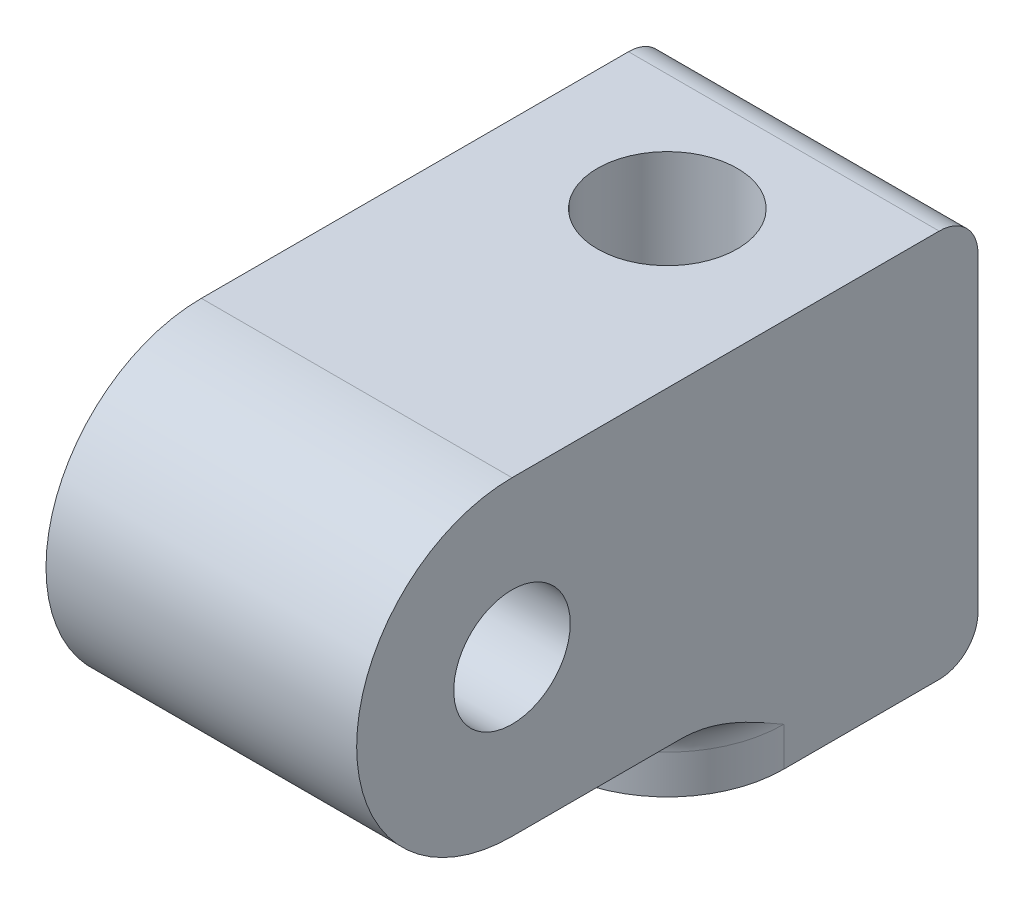
ISO-10303-21;
HEADER;
FILE_DESCRIPTION(('STEP AP214'),'2;1');
FILE_NAME('part.step','',(''),(''),'','','');
FILE_SCHEMA(('AUTOMOTIVE_DESIGN { 1 0 10303 214 1 1 1 1 }'));
ENDSEC;
DATA;
#1=APPLICATION_CONTEXT('core data for automotive mechanical design processes');
#2=APPLICATION_PROTOCOL_DEFINITION('international standard','automotive_design',2000,#1);
#3=PRODUCT_CONTEXT('',#1,'mechanical');
#4=PRODUCT('Part','Part','',(#3));
#5=PRODUCT_RELATED_PRODUCT_CATEGORY('part','',(#4));
#6=PRODUCT_DEFINITION_FORMATION('','',#4);
#7=PRODUCT_DEFINITION_CONTEXT('part definition',#1,'design');
#8=PRODUCT_DEFINITION('design','',#6,#7);
#9=PRODUCT_DEFINITION_SHAPE('','',#8);
#10=(LENGTH_UNIT() NAMED_UNIT(*) SI_UNIT(.MILLI.,.METRE.));
#11=(NAMED_UNIT(*) PLANE_ANGLE_UNIT() SI_UNIT($,.RADIAN.));
#12=(NAMED_UNIT(*) SI_UNIT($,.STERADIAN.) SOLID_ANGLE_UNIT());
#13=UNCERTAINTY_MEASURE_WITH_UNIT(LENGTH_MEASURE(1.E-05),#10,'distance_accuracy_value','');
#14=(GEOMETRIC_REPRESENTATION_CONTEXT(3) GLOBAL_UNCERTAINTY_ASSIGNED_CONTEXT((#13)) GLOBAL_UNIT_ASSIGNED_CONTEXT((#10,
#11,#12)) REPRESENTATION_CONTEXT('',''));
#15=CARTESIAN_POINT('',(0.,0.,0.));
#16=DIRECTION('',(0.,0.,1.));
#17=DIRECTION('',(1.,0.,0.));
#18=AXIS2_PLACEMENT_3D('',#15,#16,#17);
#19=CARTESIAN_POINT('',(10.16,7.62,5.08));
#20=DIRECTION('',(1.,0.,0.));
#21=DIRECTION('',(0.,0.,-1.));
#22=AXIS2_PLACEMENT_3D('',#19,#20,#21);
#23=PLANE('',#22);
#24=DIRECTION('',(0.,1.,0.));
#25=VECTOR('',#24,1.);
#26=CARTESIAN_POINT('',(10.16,0.,-10.16));
#27=LINE('',#26,#25);
#28=CARTESIAN_POINT('',(10.16,1.27,-10.16));
#29=VERTEX_POINT('',#28);
#30=CARTESIAN_POINT('',(10.16,11.43,-10.16));
#31=VERTEX_POINT('',#30);
#32=EDGE_CURVE('E171',#29,#31,#27,.T.);
#33=ORIENTED_EDGE('',*,*,#32,.T.);
#34=CARTESIAN_POINT('',(10.16,11.43,-8.89));
#35=DIRECTION('',(1.,0.,0.));
#36=DIRECTION('',(0.,0.,-1.));
#37=AXIS2_PLACEMENT_3D('',#34,#35,#36);
#38=CIRCLE('',#37,1.27);
#39=CARTESIAN_POINT('',(10.16,12.7,-8.89));
#40=VERTEX_POINT('',#39);
#41=EDGE_CURVE('E166',#31,#40,#38,.T.);
#42=ORIENTED_EDGE('',*,*,#41,.T.);
#43=DIRECTION('',(0.,0.,1.));
#44=VECTOR('',#43,1.);
#45=CARTESIAN_POINT('',(10.16,12.7,5.08));
#46=LINE('',#45,#44);
#47=CARTESIAN_POINT('',(10.16,12.7,5.08));
#48=VERTEX_POINT('',#47);
#49=EDGE_CURVE('E158',#40,#48,#46,.T.);
#50=ORIENTED_EDGE('',*,*,#49,.T.);
#51=CARTESIAN_POINT('',(10.16,7.62,5.08));
#52=DIRECTION('',(1.,0.,0.));
#53=DIRECTION('',(0.,0.,-1.));
#54=AXIS2_PLACEMENT_3D('',#51,#52,#53);
#55=CIRCLE('',#54,5.08);
#56=CARTESIAN_POINT('',(10.16,2.54,5.08));
#57=VERTEX_POINT('',#56);
#58=EDGE_CURVE('E163',#48,#57,#55,.T.);
#59=ORIENTED_EDGE('',*,*,#58,.T.);
#60=DIRECTION('',(0.,0.,-1.));
#61=VECTOR('',#60,1.);
#62=CARTESIAN_POINT('',(10.16,2.54,0.));
#63=LINE('',#62,#61);
#64=CARTESIAN_POINT('',(10.16,2.54,-0.44989583494797));
#65=VERTEX_POINT('',#64);
#66=EDGE_CURVE('E186',#57,#65,#63,.T.);
#67=ORIENTED_EDGE('',*,*,#66,.T.);
#68=CARTESIAN_POINT('',(10.16,2.54,-0.44989583494797));
#69=CARTESIAN_POINT('',(10.16,2.53997532268012,-0.545894472985572));
#70=CARTESIAN_POINT('',(10.16,2.5352435060237,-0.641762735367153));
#71=CARTESIAN_POINT('',(10.16,2.51758605749741,-0.832551529192772));
#72=CARTESIAN_POINT('',(10.16,2.50467796523076,-0.927473648641121));
#73=CARTESIAN_POINT('',(10.16,2.45595465593844,-1.20766904418462));
#74=CARTESIAN_POINT('',(10.16,2.41006676780424,-1.39118255383151));
#75=CARTESIAN_POINT('',(10.16,2.29361749517263,-1.76829186278118));
#76=CARTESIAN_POINT('',(10.16,2.22118700738842,-1.9612800146793));
#77=CARTESIAN_POINT('',(10.16,2.06041239317766,-2.34059070990035));
#78=CARTESIAN_POINT('',(10.16,1.97204999837862,-2.52690530388413));
#79=CARTESIAN_POINT('',(10.16,1.69108343218396,-3.08056685235503));
#80=CARTESIAN_POINT('',(10.16,1.48355930440187,-3.44010351414735));
#81=CARTESIAN_POINT('',(10.16,1.27411498100709,-3.80287261045626));
#82=CARTESIAN_POINT('',(10.16,1.2720574740064,-3.80643631663206));
#83=CARTESIAN_POINT('',(10.16,1.27,-3.81));
#84=B_SPLINE_CURVE_WITH_KNOTS('',3,(#68,#69,#70,#71,#72,#73,#74,#75,#76,#77,#78,#79,#80,#81,#82,
#83),.UNSPECIFIED.,.F.,.F.,(4,2,2,2,2,2,2,4),(0.,0.287684771107204,0.57475448628994,
1.14055140327335,1.75796809411921,2.37609730305224,3.62040969245718,3.63275473194816),.UNSPECIFIED.);
#85=CARTESIAN_POINT('',(10.16,1.27,-3.81));
#86=VERTEX_POINT('',#85);
#87=EDGE_CURVE('E52',#65,#86,#84,.T.);
#88=ORIENTED_EDGE('',*,*,#87,.T.);
#89=DIRECTION('',(0.,-1.,0.));
#90=VECTOR('',#89,1.);
#91=CARTESIAN_POINT('',(10.16,0.,-3.81));
#92=LINE('',#91,#90);
#93=CARTESIAN_POINT('',(10.16,0.,-3.81));
#94=VERTEX_POINT('',#93);
#95=EDGE_CURVE('E213',#86,#94,#92,.T.);
#96=ORIENTED_EDGE('',*,*,#95,.T.);
#97=DIRECTION('',(0.,0.,-1.));
#98=VECTOR('',#97,1.);
#99=CARTESIAN_POINT('',(10.16,0.,0.));
#100=LINE('',#99,#98);
#101=CARTESIAN_POINT('',(10.16,0.,-8.89));
#102=VERTEX_POINT('',#101);
#103=EDGE_CURVE('E207',#94,#102,#100,.T.);
#104=ORIENTED_EDGE('',*,*,#103,.T.);
#105=CARTESIAN_POINT('',(10.16,1.27,-8.89));
#106=DIRECTION('',(1.,0.,0.));
#107=DIRECTION('',(0.,0.,-1.));
#108=AXIS2_PLACEMENT_3D('',#105,#106,#107);
#109=CIRCLE('',#108,1.27);
#110=EDGE_CURVE('E264',#102,#29,#109,.T.);
#111=ORIENTED_EDGE('',*,*,#110,.T.);
#112=EDGE_LOOP('',(#33,#42,#50,#59,#67,#88,#96,#104,#111));
#113=FACE_BOUND('',#112,.T.);
#114=CARTESIAN_POINT('',(10.16,7.62,5.08));
#115=DIRECTION('',(1.,0.,0.));
#116=DIRECTION('',(0.,0.,-1.));
#117=AXIS2_PLACEMENT_3D('',#114,#115,#116);
#118=CIRCLE('',#117,1.905);
#119=CARTESIAN_POINT('',(10.16,7.62,3.175));
#120=VERTEX_POINT('',#119);
#121=EDGE_CURVE('E196',#120,#120,#118,.T.);
#122=ORIENTED_EDGE('',*,*,#121,.F.);
#123=EDGE_LOOP('',(#122));
#124=FACE_BOUND('',#123,.T.);
#125=ADVANCED_FACE('F42',(#113,#124),#23,.T.);
#126=CARTESIAN_POINT('',(0.,7.62,5.08));
#127=DIRECTION('',(1.,0.,0.));
#128=DIRECTION('',(0.,0.,-1.));
#129=AXIS2_PLACEMENT_3D('',#126,#127,#128);
#130=PLANE('',#129);
#131=DIRECTION('',(0.,0.,1.));
#132=VECTOR('',#131,1.);
#133=CARTESIAN_POINT('',(0.,12.7,5.08));
#134=LINE('',#133,#132);
#135=CARTESIAN_POINT('',(0.,12.7,-8.89));
#136=VERTEX_POINT('',#135);
#137=CARTESIAN_POINT('',(0.,12.7,5.08));
#138=VERTEX_POINT('',#137);
#139=EDGE_CURVE('E177',#136,#138,#134,.T.);
#140=ORIENTED_EDGE('',*,*,#139,.F.);
#141=CARTESIAN_POINT('',(0.,11.43,-8.89));
#142=DIRECTION('',(1.,0.,0.));
#143=DIRECTION('',(0.,0.,-1.));
#144=AXIS2_PLACEMENT_3D('',#141,#142,#143);
#145=CIRCLE('',#144,1.27);
#146=CARTESIAN_POINT('',(0.,11.43,-10.16));
#147=VERTEX_POINT('',#146);
#148=EDGE_CURVE('E255',#136,#147,#145,.F.);
#149=ORIENTED_EDGE('',*,*,#148,.T.);
#150=DIRECTION('',(0.,1.,0.));
#151=VECTOR('',#150,1.);
#152=CARTESIAN_POINT('',(0.,0.,-10.16));
#153=LINE('',#152,#151);
#154=CARTESIAN_POINT('',(0.,1.27,-10.16));
#155=VERTEX_POINT('',#154);
#156=EDGE_CURVE('E195',#155,#147,#153,.T.);
#157=ORIENTED_EDGE('',*,*,#156,.F.);
#158=CARTESIAN_POINT('',(0.,1.27,-8.89));
#159=DIRECTION('',(1.,0.,0.));
#160=DIRECTION('',(0.,0.,-1.));
#161=AXIS2_PLACEMENT_3D('',#158,#159,#160);
#162=CIRCLE('',#161,1.27);
#163=CARTESIAN_POINT('',(0.,0.,-8.89));
#164=VERTEX_POINT('',#163);
#165=EDGE_CURVE('E252',#155,#164,#162,.F.);
#166=ORIENTED_EDGE('',*,*,#165,.T.);
#167=DIRECTION('',(0.,0.,-1.));
#168=VECTOR('',#167,1.);
#169=CARTESIAN_POINT('',(0.,0.,0.));
#170=LINE('',#169,#168);
#171=CARTESIAN_POINT('',(0.,0.,-3.81));
#172=VERTEX_POINT('',#171);
#173=EDGE_CURVE('E192',#172,#164,#170,.T.);
#174=ORIENTED_EDGE('',*,*,#173,.F.);
#175=DIRECTION('',(0.,-1.,0.));
#176=VECTOR('',#175,1.);
#177=CARTESIAN_POINT('',(0.,7.62,-3.81));
#178=LINE('',#177,#176);
#179=CARTESIAN_POINT('',(0.,1.27,-3.81));
#180=VERTEX_POINT('',#179);
#181=EDGE_CURVE('E229',#172,#180,#178,.F.);
#182=ORIENTED_EDGE('',*,*,#181,.T.);
#183=CARTESIAN_POINT('',(0.,2.54,-0.44989583494797));
#184=CARTESIAN_POINT('',(0.,2.53997532268012,-0.545894472985575));
#185=CARTESIAN_POINT('',(0.,2.5352435060237,-0.641762735367158));
#186=CARTESIAN_POINT('',(0.,2.51758605749741,-0.832551529192782));
#187=CARTESIAN_POINT('',(0.,2.50467796523075,-0.927473648641132));
#188=CARTESIAN_POINT('',(0.,2.45595465593844,-1.20766904418463));
#189=CARTESIAN_POINT('',(0.,2.41006676780424,-1.39118255383152));
#190=CARTESIAN_POINT('',(0.,2.29361749517263,-1.76829186278117));
#191=CARTESIAN_POINT('',(0.,2.22118700738842,-1.9612800146793));
#192=CARTESIAN_POINT('',(0.,2.06041239317767,-2.34059070990034));
#193=CARTESIAN_POINT('',(0.,1.97204999837864,-2.52690530388412));
#194=CARTESIAN_POINT('',(0.,1.69108343218394,-3.08056685235501));
#195=CARTESIAN_POINT('',(0.,1.48355930440175,-3.44010351414727));
#196=CARTESIAN_POINT('',(0.,1.27411498100709,-3.80287261045626));
#197=CARTESIAN_POINT('',(0.,1.2720574740064,-3.80643631663206));
#198=CARTESIAN_POINT('',(0.,1.27,-3.81));
#199=B_SPLINE_CURVE_WITH_KNOTS('',3,(#183,#184,#185,#186,#187,#188,#189,#190,#191,#192,#193,
#194,#195,#196,#197,#198),.UNSPECIFIED.,.F.,.F.,(4,2,2,2,2,2,2,4),(0.,0.287684771107212,
0.574754486289953,1.14055140327335,1.7579680941192,2.37609730305223,3.62040969245718,
3.63275473194816),.UNSPECIFIED.);
#200=CARTESIAN_POINT('',(0.,2.54,-0.44989583494797));
#201=VERTEX_POINT('',#200);
#202=EDGE_CURVE('E11',#180,#201,#199,.F.);
#203=ORIENTED_EDGE('',*,*,#202,.T.);
#204=DIRECTION('',(0.,0.,-1.));
#205=VECTOR('',#204,1.);
#206=CARTESIAN_POINT('',(0.,2.54,0.));
#207=LINE('',#206,#205);
#208=CARTESIAN_POINT('',(0.,2.54,5.08));
#209=VERTEX_POINT('',#208);
#210=EDGE_CURVE('E203',#209,#201,#207,.T.);
#211=ORIENTED_EDGE('',*,*,#210,.F.);
#212=CARTESIAN_POINT('',(0.,7.62,5.08));
#213=DIRECTION('',(1.,0.,0.));
#214=DIRECTION('',(0.,0.,-1.));
#215=AXIS2_PLACEMENT_3D('',#212,#213,#214);
#216=CIRCLE('',#215,5.08);
#217=EDGE_CURVE('E201',#138,#209,#216,.T.);
#218=ORIENTED_EDGE('',*,*,#217,.F.);
#219=EDGE_LOOP('',(#140,#149,#157,#166,#174,#182,#203,#211,#218));
#220=FACE_BOUND('',#219,.T.);
#221=CARTESIAN_POINT('',(0.,7.62,5.08));
#222=DIRECTION('',(1.,0.,0.));
#223=DIRECTION('',(0.,0.,-1.));
#224=AXIS2_PLACEMENT_3D('',#221,#222,#223);
#225=CIRCLE('',#224,1.905);
#226=CARTESIAN_POINT('',(0.,7.62,3.175));
#227=VERTEX_POINT('',#226);
#228=EDGE_CURVE('E368',#227,#227,#225,.T.);
#229=ORIENTED_EDGE('',*,*,#228,.T.);
#230=EDGE_LOOP('',(#229));
#231=FACE_BOUND('',#230,.T.);
#232=ADVANCED_FACE('F294',(#220,#231),#130,.F.);
#233=CARTESIAN_POINT('',(10.16,0.,0.));
#234=DIRECTION('',(0.,0.,-1.));
#235=DIRECTION('',(0.,1.,0.));
#236=AXIS2_PLACEMENT_3D('',#233,#234,#235);
#237=PLANE('',#236);
#238=DIRECTION('',(0.,-1.,0.));
#239=VECTOR('',#238,1.);
#240=CARTESIAN_POINT('',(6.35,2.54,0.));
#241=LINE('',#240,#239);
#242=CARTESIAN_POINT('',(6.35,0.,0.));
#243=VERTEX_POINT('',#242);
#244=CARTESIAN_POINT('',(6.35,1.27,0.));
#245=VERTEX_POINT('',#244);
#246=EDGE_CURVE('E225',#243,#245,#241,.F.);
#247=ORIENTED_EDGE('',*,*,#246,.T.);
#248=DIRECTION('',(-1.,0.,0.));
#249=VECTOR('',#248,1.);
#250=CARTESIAN_POINT('',(3.81,1.27,0.));
#251=LINE('',#250,#249);
#252=CARTESIAN_POINT('',(3.81,1.27,0.));
#253=VERTEX_POINT('',#252);
#254=EDGE_CURVE('E271',#245,#253,#251,.T.);
#255=ORIENTED_EDGE('',*,*,#254,.T.);
#256=DIRECTION('',(0.,-1.,0.));
#257=VECTOR('',#256,1.);
#258=CARTESIAN_POINT('',(3.81,0.,0.));
#259=LINE('',#258,#257);
#260=CARTESIAN_POINT('',(3.81,0.,0.));
#261=VERTEX_POINT('',#260);
#262=EDGE_CURVE('E222',#253,#261,#259,.T.);
#263=ORIENTED_EDGE('',*,*,#262,.T.);
#264=DIRECTION('',(-1.,0.,0.));
#265=VECTOR('',#264,1.);
#266=CARTESIAN_POINT('',(10.16,0.,0.));
#267=LINE('',#266,#265);
#268=EDGE_CURVE('E180',#243,#261,#267,.T.);
#269=ORIENTED_EDGE('',*,*,#268,.F.);
#270=EDGE_LOOP('',(#247,#255,#263,#269));
#271=FACE_BOUND('',#270,.T.);
#272=ADVANCED_FACE('F300',(#271),#237,.F.);
#273=CARTESIAN_POINT('',(10.16,0.,0.));
#274=DIRECTION('',(0.,1.,0.));
#275=DIRECTION('',(0.,0.,1.));
#276=AXIS2_PLACEMENT_3D('',#273,#274,#275);
#277=PLANE('',#276);
#278=CARTESIAN_POINT('',(5.08,0.,-5.08));
#279=DIRECTION('',(0.,1.,0.));
#280=DIRECTION('',(0.,0.,1.));
#281=AXIS2_PLACEMENT_3D('',#278,#279,#280);
#282=CIRCLE('',#281,2.286);
#283=CARTESIAN_POINT('',(5.08,0.,-2.794));
#284=VERTEX_POINT('',#283);
#285=EDGE_CURVE('E353',#284,#284,#282,.T.);
#286=ORIENTED_EDGE('',*,*,#285,.T.);
#287=EDGE_LOOP('',(#286));
#288=FACE_BOUND('',#287,.T.);
#289=ORIENTED_EDGE('',*,*,#173,.T.);
#290=DIRECTION('',(-1.,0.,0.));
#291=VECTOR('',#290,1.);
#292=CARTESIAN_POINT('',(10.16,0.,-8.89));
#293=LINE('',#292,#291);
#294=EDGE_CURVE('E63',#164,#102,#293,.F.);
#295=ORIENTED_EDGE('',*,*,#294,.T.);
#296=ORIENTED_EDGE('',*,*,#103,.F.);
#297=CARTESIAN_POINT('',(6.35,0.,-3.81));
#298=DIRECTION('',(0.,1.,0.));
#299=DIRECTION('',(0.,0.,1.));
#300=AXIS2_PLACEMENT_3D('',#297,#298,#299);
#301=CIRCLE('',#300,3.81);
#302=EDGE_CURVE('E219',#94,#243,#301,.F.);
#303=ORIENTED_EDGE('',*,*,#302,.T.);
#304=ORIENTED_EDGE('',*,*,#268,.T.);
#305=CARTESIAN_POINT('',(3.81,0.,-3.81));
#306=DIRECTION('',(0.,1.,0.));
#307=DIRECTION('',(0.,0.,1.));
#308=AXIS2_PLACEMENT_3D('',#305,#306,#307);
#309=CIRCLE('',#308,3.81);
#310=EDGE_CURVE('E216',#261,#172,#309,.F.);
#311=ORIENTED_EDGE('',*,*,#310,.T.);
#312=EDGE_LOOP('',(#289,#295,#296,#303,#304,#311));
#313=FACE_BOUND('',#312,.T.);
#314=ADVANCED_FACE('F314',(#288,#313),#277,.F.);
#315=CARTESIAN_POINT('',(10.16,0.,-10.16));
#316=DIRECTION('',(0.,0.,1.));
#317=DIRECTION('',(1.,0.,0.));
#318=AXIS2_PLACEMENT_3D('',#315,#316,#317);
#319=PLANE('',#318);
#320=ORIENTED_EDGE('',*,*,#156,.T.);
#321=DIRECTION('',(-1.,0.,0.));
#322=VECTOR('',#321,1.);
#323=CARTESIAN_POINT('',(10.16,11.43,-10.16));
#324=LINE('',#323,#322);
#325=EDGE_CURVE('E74',#147,#31,#324,.F.);
#326=ORIENTED_EDGE('',*,*,#325,.T.);
#327=ORIENTED_EDGE('',*,*,#32,.F.);
#328=DIRECTION('',(-1.,0.,0.));
#329=VECTOR('',#328,1.);
#330=CARTESIAN_POINT('',(10.16,1.27,-10.16));
#331=LINE('',#330,#329);
#332=EDGE_CURVE('E258',#29,#155,#331,.T.);
#333=ORIENTED_EDGE('',*,*,#332,.T.);
#334=EDGE_LOOP('',(#320,#326,#327,#333));
#335=FACE_BOUND('',#334,.T.);
#336=ADVANCED_FACE('F310',(#335),#319,.F.);
#337=CARTESIAN_POINT('',(10.16,12.7,5.08));
#338=DIRECTION('',(0.,-1.,0.));
#339=DIRECTION('',(0.,0.,-1.));
#340=AXIS2_PLACEMENT_3D('',#337,#338,#339);
#341=PLANE('',#340);
#342=CARTESIAN_POINT('',(5.08,12.7,-5.08));
#343=DIRECTION('',(0.,1.,0.));
#344=DIRECTION('',(0.,0.,1.));
#345=AXIS2_PLACEMENT_3D('',#342,#343,#344);
#346=CIRCLE('',#345,2.286);
#347=CARTESIAN_POINT('',(5.08,12.7,-2.794));
#348=VERTEX_POINT('',#347);
#349=EDGE_CURVE('E349',#348,#348,#346,.T.);
#350=ORIENTED_EDGE('',*,*,#349,.F.);
#351=EDGE_LOOP('',(#350));
#352=FACE_BOUND('',#351,.T.);
#353=ORIENTED_EDGE('',*,*,#49,.F.);
#354=DIRECTION('',(-1.,0.,0.));
#355=VECTOR('',#354,1.);
#356=CARTESIAN_POINT('',(10.16,12.7,-8.89));
#357=LINE('',#356,#355);
#358=EDGE_CURVE('E249',#40,#136,#357,.T.);
#359=ORIENTED_EDGE('',*,*,#358,.T.);
#360=ORIENTED_EDGE('',*,*,#139,.T.);
#361=DIRECTION('',(-1.,0.,0.));
#362=VECTOR('',#361,1.);
#363=CARTESIAN_POINT('',(10.16,12.7,5.08));
#364=LINE('',#363,#362);
#365=EDGE_CURVE('E174',#48,#138,#364,.T.);
#366=ORIENTED_EDGE('',*,*,#365,.F.);
#367=EDGE_LOOP('',(#353,#359,#360,#366));
#368=FACE_BOUND('',#367,.T.);
#369=ADVANCED_FACE('F175',(#352,#368),#341,.F.);
#370=CARTESIAN_POINT('',(10.16,7.62,5.08));
#371=DIRECTION('',(-1.,0.,0.));
#372=DIRECTION('',(0.,0.,1.));
#373=AXIS2_PLACEMENT_3D('',#370,#371,#372);
#374=CYLINDRICAL_SURFACE('',#373,5.08);
#375=ORIENTED_EDGE('',*,*,#217,.T.);
#376=DIRECTION('',(-1.,0.,0.));
#377=VECTOR('',#376,1.);
#378=CARTESIAN_POINT('',(10.16,2.54,5.08));
#379=LINE('',#378,#377);
#380=EDGE_CURVE('E181',#57,#209,#379,.T.);
#381=ORIENTED_EDGE('',*,*,#380,.F.);
#382=ORIENTED_EDGE('',*,*,#58,.F.);
#383=ORIENTED_EDGE('',*,*,#365,.T.);
#384=EDGE_LOOP('',(#375,#381,#382,#383));
#385=FACE_BOUND('',#384,.T.);
#386=ADVANCED_FACE('F183',(#385),#374,.T.);
#387=CARTESIAN_POINT('',(10.16,2.54,0.));
#388=DIRECTION('',(0.,1.,0.));
#389=DIRECTION('',(0.,0.,1.));
#390=AXIS2_PLACEMENT_3D('',#387,#388,#389);
#391=PLANE('',#390);
#392=DIRECTION('',(-1.,0.,0.));
#393=VECTOR('',#392,1.);
#394=CARTESIAN_POINT('',(6.35,2.54,1.27));
#395=LINE('',#394,#393);
#396=CARTESIAN_POINT('',(3.81,2.54,1.27));
#397=VERTEX_POINT('',#396);
#398=CARTESIAN_POINT('',(6.35,2.54,1.27));
#399=VERTEX_POINT('',#398);
#400=EDGE_CURVE('E233',#397,#399,#395,.F.);
#401=ORIENTED_EDGE('',*,*,#400,.T.);
#402=CARTESIAN_POINT('',(6.35,2.54,-3.81));
#403=DIRECTION('',(0.,1.,0.));
#404=DIRECTION('',(0.,0.,1.));
#405=AXIS2_PLACEMENT_3D('',#402,#403,#404);
#406=CIRCLE('',#405,5.08);
#407=EDGE_CURVE('E239',#399,#65,#406,.T.);
#408=ORIENTED_EDGE('',*,*,#407,.T.);
#409=ORIENTED_EDGE('',*,*,#66,.F.);
#410=ORIENTED_EDGE('',*,*,#380,.T.);
#411=ORIENTED_EDGE('',*,*,#210,.T.);
#412=CARTESIAN_POINT('',(3.81,2.54,-3.81));
#413=DIRECTION('',(0.,1.,0.));
#414=DIRECTION('',(0.,0.,1.));
#415=AXIS2_PLACEMENT_3D('',#412,#413,#414);
#416=CIRCLE('',#415,5.08);
#417=EDGE_CURVE('E236',#201,#397,#416,.T.);
#418=ORIENTED_EDGE('',*,*,#417,.T.);
#419=EDGE_LOOP('',(#401,#408,#409,#410,#411,#418));
#420=FACE_BOUND('',#419,.T.);
#421=ADVANCED_FACE('F302',(#420),#391,.F.);
#422=CARTESIAN_POINT('',(10.16,7.62,5.08));
#423=DIRECTION('',(-1.,0.,0.));
#424=DIRECTION('',(0.,0.,1.));
#425=AXIS2_PLACEMENT_3D('',#422,#423,#424);
#426=CYLINDRICAL_SURFACE('',#425,1.905);
#427=ORIENTED_EDGE('',*,*,#121,.T.);
#428=EDGE_LOOP('',(#427));
#429=FACE_BOUND('',#428,.T.);
#430=ORIENTED_EDGE('',*,*,#228,.F.);
#431=EDGE_LOOP('',(#430));
#432=FACE_BOUND('',#431,.T.);
#433=ADVANCED_FACE('F295',(#429,#432),#426,.F.);
#434=CARTESIAN_POINT('',(5.08,0.,-5.08));
#435=DIRECTION('',(0.,1.,0.));
#436=DIRECTION('',(0.,0.,1.));
#437=AXIS2_PLACEMENT_3D('',#434,#435,#436);
#438=CYLINDRICAL_SURFACE('',#437,2.286);
#439=ORIENTED_EDGE('',*,*,#285,.F.);
#440=EDGE_LOOP('',(#439));
#441=FACE_BOUND('',#440,.T.);
#442=ORIENTED_EDGE('',*,*,#349,.T.);
#443=EDGE_LOOP('',(#442));
#444=FACE_BOUND('',#443,.T.);
#445=ADVANCED_FACE('F324',(#441,#444),#438,.F.);
#446=CARTESIAN_POINT('',(6.35,7.62,-3.81));
#447=DIRECTION('',(0.,1.,0.));
#448=DIRECTION('',(0.,0.,1.));
#449=AXIS2_PLACEMENT_3D('',#446,#447,#448);
#450=CYLINDRICAL_SURFACE('',#449,3.81);
#451=ORIENTED_EDGE('',*,*,#95,.F.);
#452=CARTESIAN_POINT('',(6.35,1.27,-3.81));
#453=DIRECTION('',(0.,1.,0.));
#454=DIRECTION('',(0.,0.,1.));
#455=AXIS2_PLACEMENT_3D('',#452,#453,#454);
#456=CIRCLE('',#455,3.81);
#457=EDGE_CURVE('E243',#86,#245,#456,.F.);
#458=ORIENTED_EDGE('',*,*,#457,.T.);
#459=ORIENTED_EDGE('',*,*,#246,.F.);
#460=ORIENTED_EDGE('',*,*,#302,.F.);
#461=EDGE_LOOP('',(#451,#458,#459,#460));
#462=FACE_BOUND('',#461,.T.);
#463=ADVANCED_FACE('F321',(#462),#450,.T.);
#464=CARTESIAN_POINT('',(3.81,0.,-3.81));
#465=DIRECTION('',(0.,-1.,0.));
#466=DIRECTION('',(0.,0.,-1.));
#467=AXIS2_PLACEMENT_3D('',#464,#465,#466);
#468=CYLINDRICAL_SURFACE('',#467,3.81);
#469=ORIENTED_EDGE('',*,*,#262,.F.);
#470=CARTESIAN_POINT('',(3.81,1.27,-3.81));
#471=DIRECTION('',(0.,1.,0.));
#472=DIRECTION('',(0.,0.,1.));
#473=AXIS2_PLACEMENT_3D('',#470,#471,#472);
#474=CIRCLE('',#473,3.81);
#475=EDGE_CURVE('E246',#253,#180,#474,.F.);
#476=ORIENTED_EDGE('',*,*,#475,.T.);
#477=ORIENTED_EDGE('',*,*,#181,.F.);
#478=ORIENTED_EDGE('',*,*,#310,.F.);
#479=EDGE_LOOP('',(#469,#476,#477,#478));
#480=FACE_BOUND('',#479,.T.);
#481=ADVANCED_FACE('F323',(#480),#468,.T.);
#482=CARTESIAN_POINT('',(3.81,1.27,-3.81));
#483=DIRECTION('',(0.,1.,0.));
#484=DIRECTION('',(0.,0.,1.));
#485=AXIS2_PLACEMENT_3D('',#482,#483,#484);
#486=TOROIDAL_SURFACE('',#485,5.08,1.27);
#487=ORIENTED_EDGE('',*,*,#202,.F.);
#488=ORIENTED_EDGE('',*,*,#475,.F.);
#489=CARTESIAN_POINT('',(3.81,1.27,1.27));
#490=DIRECTION('',(-1.,0.,0.));
#491=DIRECTION('',(0.,0.,1.));
#492=AXIS2_PLACEMENT_3D('',#489,#490,#491);
#493=CIRCLE('',#492,1.27);
#494=EDGE_CURVE('E46',#397,#253,#493,.T.);
#495=ORIENTED_EDGE('',*,*,#494,.F.);
#496=ORIENTED_EDGE('',*,*,#417,.F.);
#497=EDGE_LOOP('',(#487,#488,#495,#496));
#498=FACE_BOUND('',#497,.T.);
#499=ADVANCED_FACE('F327',(#498),#486,.F.);
#500=CARTESIAN_POINT('',(10.16,1.27,1.27));
#501=DIRECTION('',(1.,0.,0.));
#502=DIRECTION('',(0.,0.,-1.));
#503=AXIS2_PLACEMENT_3D('',#500,#501,#502);
#504=CYLINDRICAL_SURFACE('',#503,1.27);
#505=ORIENTED_EDGE('',*,*,#494,.T.);
#506=ORIENTED_EDGE('',*,*,#254,.F.);
#507=CARTESIAN_POINT('',(6.35,1.27,1.27));
#508=DIRECTION('',(-1.,0.,0.));
#509=DIRECTION('',(0.,0.,1.));
#510=AXIS2_PLACEMENT_3D('',#507,#508,#509);
#511=CIRCLE('',#510,1.27);
#512=EDGE_CURVE('E350',#399,#245,#511,.T.);
#513=ORIENTED_EDGE('',*,*,#512,.F.);
#514=ORIENTED_EDGE('',*,*,#400,.F.);
#515=EDGE_LOOP('',(#505,#506,#513,#514));
#516=FACE_BOUND('',#515,.T.);
#517=ADVANCED_FACE('F332',(#516),#504,.F.);
#518=CARTESIAN_POINT('',(6.35,1.27,-3.81));
#519=DIRECTION('',(0.,1.,0.));
#520=DIRECTION('',(0.,0.,1.));
#521=AXIS2_PLACEMENT_3D('',#518,#519,#520);
#522=TOROIDAL_SURFACE('',#521,5.08,1.27);
#523=ORIENTED_EDGE('',*,*,#512,.T.);
#524=ORIENTED_EDGE('',*,*,#457,.F.);
#525=ORIENTED_EDGE('',*,*,#87,.F.);
#526=ORIENTED_EDGE('',*,*,#407,.F.);
#527=EDGE_LOOP('',(#523,#524,#525,#526));
#528=FACE_BOUND('',#527,.T.);
#529=ADVANCED_FACE('F287',(#528),#522,.F.);
#530=CARTESIAN_POINT('',(10.16,11.43,-8.89));
#531=DIRECTION('',(-1.,0.,0.));
#532=DIRECTION('',(0.,0.,1.));
#533=AXIS2_PLACEMENT_3D('',#530,#531,#532);
#534=CYLINDRICAL_SURFACE('',#533,1.27);
#535=ORIENTED_EDGE('',*,*,#41,.F.);
#536=ORIENTED_EDGE('',*,*,#325,.F.);
#537=ORIENTED_EDGE('',*,*,#148,.F.);
#538=ORIENTED_EDGE('',*,*,#358,.F.);
#539=EDGE_LOOP('',(#535,#536,#537,#538));
#540=FACE_BOUND('',#539,.T.);
#541=ADVANCED_FACE('F462',(#540),#534,.T.);
#542=CARTESIAN_POINT('',(10.16,1.27,-8.89));
#543=DIRECTION('',(-1.,0.,0.));
#544=DIRECTION('',(0.,0.,1.));
#545=AXIS2_PLACEMENT_3D('',#542,#543,#544);
#546=CYLINDRICAL_SURFACE('',#545,1.27);
#547=ORIENTED_EDGE('',*,*,#110,.F.);
#548=ORIENTED_EDGE('',*,*,#294,.F.);
#549=ORIENTED_EDGE('',*,*,#165,.F.);
#550=ORIENTED_EDGE('',*,*,#332,.F.);
#551=EDGE_LOOP('',(#547,#548,#549,#550));
#552=FACE_BOUND('',#551,.T.);
#553=ADVANCED_FACE('F44',(#552),#546,.T.);
#554=CLOSED_SHELL('',(#125,#232,#272,#314,#336,#369,#386,#421,#433,#445,#463,#481,#499,#517,
#529,#541,#553));
#555=MANIFOLD_SOLID_BREP('B2',#554);
#556=ADVANCED_BREP_SHAPE_REPRESENTATION('',(#18,#555),#14);
#557=SHAPE_DEFINITION_REPRESENTATION(#9,#556);
ENDSEC;
END-ISO-10303-21;
